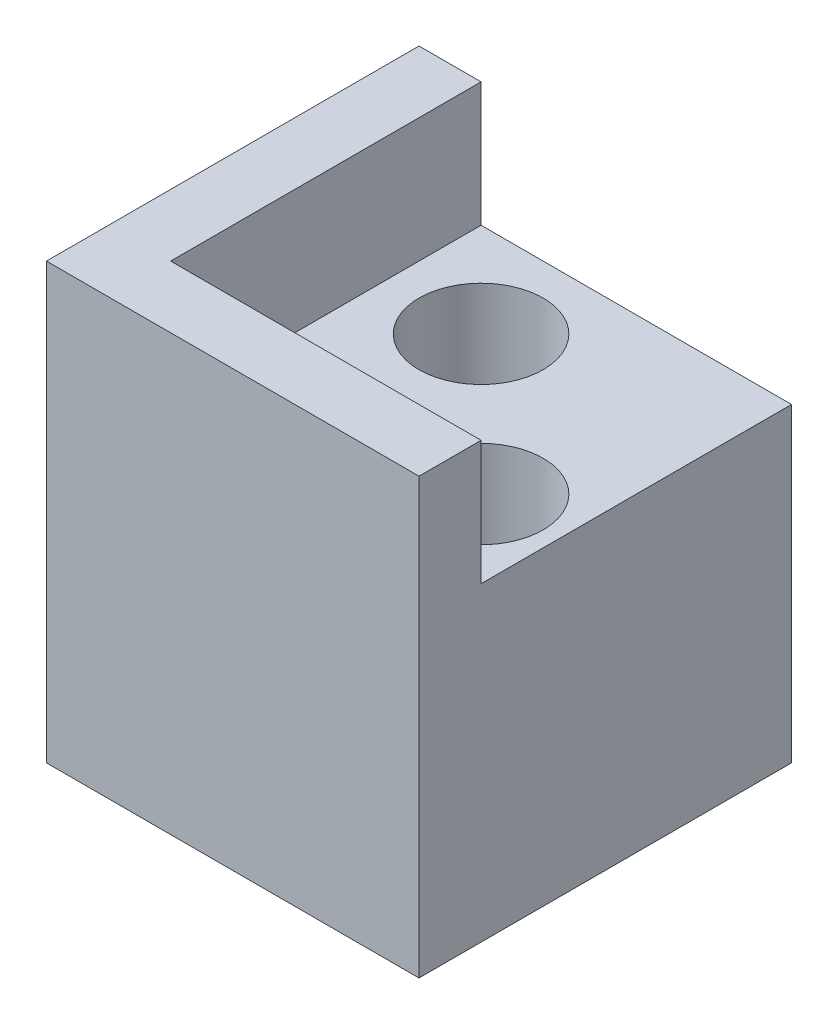
ISO-10303-21;
HEADER;
FILE_DESCRIPTION(('STEP AP214'),'2;1');
FILE_NAME('part.step','',(''),(''),'','','');
FILE_SCHEMA(('AUTOMOTIVE_DESIGN { 1 0 10303 214 1 1 1 1 }'));
ENDSEC;
DATA;
#1=APPLICATION_CONTEXT('core data for automotive mechanical design processes');
#2=APPLICATION_PROTOCOL_DEFINITION('international standard','automotive_design',2000,#1);
#3=PRODUCT_CONTEXT('',#1,'mechanical');
#4=PRODUCT('Part','Part','',(#3));
#5=PRODUCT_RELATED_PRODUCT_CATEGORY('part','',(#4));
#6=PRODUCT_DEFINITION_FORMATION('','',#4);
#7=PRODUCT_DEFINITION_CONTEXT('part definition',#1,'design');
#8=PRODUCT_DEFINITION('design','',#6,#7);
#9=PRODUCT_DEFINITION_SHAPE('','',#8);
#10=(LENGTH_UNIT() NAMED_UNIT(*) SI_UNIT(.MILLI.,.METRE.));
#11=(NAMED_UNIT(*) PLANE_ANGLE_UNIT() SI_UNIT($,.RADIAN.));
#12=(NAMED_UNIT(*) SI_UNIT($,.STERADIAN.) SOLID_ANGLE_UNIT());
#13=UNCERTAINTY_MEASURE_WITH_UNIT(LENGTH_MEASURE(1.E-05),#10,'distance_accuracy_value','');
#14=(GEOMETRIC_REPRESENTATION_CONTEXT(3) GLOBAL_UNCERTAINTY_ASSIGNED_CONTEXT((#13)) GLOBAL_UNIT_ASSIGNED_CONTEXT((#10,
#11,#12)) REPRESENTATION_CONTEXT('',''));
#15=CARTESIAN_POINT('',(0.,0.,0.));
#16=DIRECTION('',(0.,0.,1.));
#17=DIRECTION('',(1.,0.,0.));
#18=AXIS2_PLACEMENT_3D('',#15,#16,#17);
#19=CARTESIAN_POINT('',(15.,35.,-15.));
#20=DIRECTION('',(-1.,0.,0.));
#21=DIRECTION('',(0.,0.,1.));
#22=AXIS2_PLACEMENT_3D('',#19,#20,#21);
#23=PLANE('',#22);
#24=DIRECTION('',(0.,0.,-1.));
#25=VECTOR('',#24,1.);
#26=CARTESIAN_POINT('',(15.,25.,-15.));
#27=LINE('',#26,#25);
#28=CARTESIAN_POINT('',(15.,25.,10.));
#29=VERTEX_POINT('',#28);
#30=CARTESIAN_POINT('',(15.,25.,-15.));
#31=VERTEX_POINT('',#30);
#32=EDGE_CURVE('E101',#29,#31,#27,.T.);
#33=ORIENTED_EDGE('',*,*,#32,.F.);
#34=DIRECTION('',(0.,1.,0.));
#35=VECTOR('',#34,1.);
#36=CARTESIAN_POINT('',(15.,25.,10.));
#37=LINE('',#36,#35);
#38=CARTESIAN_POINT('',(15.,35.,10.));
#39=VERTEX_POINT('',#38);
#40=EDGE_CURVE('E125',#29,#39,#37,.T.);
#41=ORIENTED_EDGE('',*,*,#40,.T.);
#42=DIRECTION('',(0.,0.,-1.));
#43=VECTOR('',#42,1.);
#44=CARTESIAN_POINT('',(15.,35.,-15.));
#45=LINE('',#44,#43);
#46=CARTESIAN_POINT('',(15.,35.,15.));
#47=VERTEX_POINT('',#46);
#48=EDGE_CURVE('E136',#47,#39,#45,.T.);
#49=ORIENTED_EDGE('',*,*,#48,.F.);
#50=DIRECTION('',(0.,-1.,0.));
#51=VECTOR('',#50,1.);
#52=CARTESIAN_POINT('',(15.,35.,15.));
#53=LINE('',#52,#51);
#54=CARTESIAN_POINT('',(15.,0.,15.));
#55=VERTEX_POINT('',#54);
#56=EDGE_CURVE('E122',#47,#55,#53,.T.);
#57=ORIENTED_EDGE('',*,*,#56,.T.);
#58=DIRECTION('',(0.,0.,-1.));
#59=VECTOR('',#58,1.);
#60=CARTESIAN_POINT('',(15.,0.,-15.));
#61=LINE('',#60,#59);
#62=CARTESIAN_POINT('',(15.,0.,-15.));
#63=VERTEX_POINT('',#62);
#64=EDGE_CURVE('E120',#55,#63,#61,.T.);
#65=ORIENTED_EDGE('',*,*,#64,.T.);
#66=DIRECTION('',(0.,-1.,0.));
#67=VECTOR('',#66,1.);
#68=CARTESIAN_POINT('',(15.,35.,-15.));
#69=LINE('',#68,#67);
#70=EDGE_CURVE('E11',#31,#63,#69,.T.);
#71=ORIENTED_EDGE('',*,*,#70,.F.);
#72=EDGE_LOOP('',(#33,#41,#49,#57,#65,#71));
#73=FACE_BOUND('',#72,.T.);
#74=ADVANCED_FACE('F33',(#73),#23,.F.);
#75=CARTESIAN_POINT('',(-15.,35.,-15.));
#76=DIRECTION('',(0.,0.,1.));
#77=DIRECTION('',(1.,0.,0.));
#78=AXIS2_PLACEMENT_3D('',#75,#76,#77);
#79=PLANE('',#78);
#80=DIRECTION('',(-1.,0.,0.));
#81=VECTOR('',#80,1.);
#82=CARTESIAN_POINT('',(-15.,35.,-15.));
#83=LINE('',#82,#81);
#84=CARTESIAN_POINT('',(-10.,35.,-15.));
#85=VERTEX_POINT('',#84);
#86=CARTESIAN_POINT('',(-15.,35.,-15.));
#87=VERTEX_POINT('',#86);
#88=EDGE_CURVE('E79',#85,#87,#83,.T.);
#89=ORIENTED_EDGE('',*,*,#88,.F.);
#90=DIRECTION('',(0.,1.,0.));
#91=VECTOR('',#90,1.);
#92=CARTESIAN_POINT('',(-10.,25.,-15.));
#93=LINE('',#92,#91);
#94=CARTESIAN_POINT('',(-10.,25.,-15.));
#95=VERTEX_POINT('',#94);
#96=EDGE_CURVE('E47',#95,#85,#93,.T.);
#97=ORIENTED_EDGE('',*,*,#96,.F.);
#98=DIRECTION('',(-1.,0.,0.));
#99=VECTOR('',#98,1.);
#100=CARTESIAN_POINT('',(15.,25.,-15.));
#101=LINE('',#100,#99);
#102=EDGE_CURVE('E105',#31,#95,#101,.T.);
#103=ORIENTED_EDGE('',*,*,#102,.F.);
#104=ORIENTED_EDGE('',*,*,#70,.T.);
#105=DIRECTION('',(-1.,0.,0.));
#106=VECTOR('',#105,1.);
#107=CARTESIAN_POINT('',(-15.,0.,-15.));
#108=LINE('',#107,#106);
#109=CARTESIAN_POINT('',(-15.,0.,-15.));
#110=VERTEX_POINT('',#109);
#111=EDGE_CURVE('E124',#63,#110,#108,.T.);
#112=ORIENTED_EDGE('',*,*,#111,.T.);
#113=DIRECTION('',(0.,-1.,0.));
#114=VECTOR('',#113,1.);
#115=CARTESIAN_POINT('',(-15.,35.,-15.));
#116=LINE('',#115,#114);
#117=EDGE_CURVE('E40',#87,#110,#116,.T.);
#118=ORIENTED_EDGE('',*,*,#117,.F.);
#119=EDGE_LOOP('',(#89,#97,#103,#104,#112,#118));
#120=FACE_BOUND('',#119,.T.);
#121=ADVANCED_FACE('F114',(#120),#79,.F.);
#122=CARTESIAN_POINT('',(-15.,35.,-15.));
#123=DIRECTION('',(1.,0.,0.));
#124=DIRECTION('',(0.,0.,-1.));
#125=AXIS2_PLACEMENT_3D('',#122,#123,#124);
#126=PLANE('',#125);
#127=DIRECTION('',(0.,0.,1.));
#128=VECTOR('',#127,1.);
#129=CARTESIAN_POINT('',(-15.,0.,-15.));
#130=LINE('',#129,#128);
#131=CARTESIAN_POINT('',(-15.,0.,15.));
#132=VERTEX_POINT('',#131);
#133=EDGE_CURVE('E127',#110,#132,#130,.T.);
#134=ORIENTED_EDGE('',*,*,#133,.T.);
#135=DIRECTION('',(0.,-1.,0.));
#136=VECTOR('',#135,1.);
#137=CARTESIAN_POINT('',(-15.,35.,15.));
#138=LINE('',#137,#136);
#139=CARTESIAN_POINT('',(-15.,35.,15.));
#140=VERTEX_POINT('',#139);
#141=EDGE_CURVE('E138',#140,#132,#138,.T.);
#142=ORIENTED_EDGE('',*,*,#141,.F.);
#143=DIRECTION('',(0.,0.,1.));
#144=VECTOR('',#143,1.);
#145=CARTESIAN_POINT('',(-15.,35.,-15.));
#146=LINE('',#145,#144);
#147=EDGE_CURVE('E145',#87,#140,#146,.T.);
#148=ORIENTED_EDGE('',*,*,#147,.F.);
#149=ORIENTED_EDGE('',*,*,#117,.T.);
#150=EDGE_LOOP('',(#134,#142,#148,#149));
#151=FACE_BOUND('',#150,.T.);
#152=ADVANCED_FACE('F143',(#151),#126,.F.);
#153=CARTESIAN_POINT('',(-15.,35.,15.));
#154=DIRECTION('',(0.,0.,-1.));
#155=DIRECTION('',(-1.,0.,0.));
#156=AXIS2_PLACEMENT_3D('',#153,#154,#155);
#157=PLANE('',#156);
#158=DIRECTION('',(1.,0.,0.));
#159=VECTOR('',#158,1.);
#160=CARTESIAN_POINT('',(-15.,0.,15.));
#161=LINE('',#160,#159);
#162=EDGE_CURVE('E75',#132,#55,#161,.T.);
#163=ORIENTED_EDGE('',*,*,#162,.T.);
#164=ORIENTED_EDGE('',*,*,#56,.F.);
#165=DIRECTION('',(1.,0.,0.));
#166=VECTOR('',#165,1.);
#167=CARTESIAN_POINT('',(-15.,35.,15.));
#168=LINE('',#167,#166);
#169=EDGE_CURVE('E56',#140,#47,#168,.T.);
#170=ORIENTED_EDGE('',*,*,#169,.F.);
#171=ORIENTED_EDGE('',*,*,#141,.T.);
#172=EDGE_LOOP('',(#163,#164,#170,#171));
#173=FACE_BOUND('',#172,.T.);
#174=ADVANCED_FACE('F159',(#173),#157,.F.);
#175=CARTESIAN_POINT('',(0.,35.,0.));
#176=DIRECTION('',(0.,1.,0.));
#177=DIRECTION('',(0.,0.,1.));
#178=AXIS2_PLACEMENT_3D('',#175,#176,#177);
#179=PLANE('',#178);
#180=DIRECTION('',(1.,0.,0.));
#181=VECTOR('',#180,1.);
#182=CARTESIAN_POINT('',(15.,35.,10.));
#183=LINE('',#182,#181);
#184=CARTESIAN_POINT('',(-10.,35.,10.));
#185=VERTEX_POINT('',#184);
#186=EDGE_CURVE('E111',#185,#39,#183,.T.);
#187=ORIENTED_EDGE('',*,*,#186,.F.);
#188=DIRECTION('',(0.,0.,1.));
#189=VECTOR('',#188,1.);
#190=CARTESIAN_POINT('',(-10.,35.,-15.));
#191=LINE('',#190,#189);
#192=EDGE_CURVE('E293',#85,#185,#191,.T.);
#193=ORIENTED_EDGE('',*,*,#192,.F.);
#194=ORIENTED_EDGE('',*,*,#88,.T.);
#195=ORIENTED_EDGE('',*,*,#147,.T.);
#196=ORIENTED_EDGE('',*,*,#169,.T.);
#197=ORIENTED_EDGE('',*,*,#48,.T.);
#198=EDGE_LOOP('',(#187,#193,#194,#195,#196,#197));
#199=FACE_BOUND('',#198,.T.);
#200=ADVANCED_FACE('F149',(#199),#179,.T.);
#201=CARTESIAN_POINT('',(0.,0.,0.));
#202=DIRECTION('',(0.,1.,0.));
#203=DIRECTION('',(0.,0.,1.));
#204=AXIS2_PLACEMENT_3D('',#201,#202,#203);
#205=PLANE('',#204);
#206=CARTESIAN_POINT('',(-2.42286276232723,0.,-7.42286276232722));
#207=DIRECTION('',(0.,1.,0.));
#208=DIRECTION('',(0.,0.,1.));
#209=AXIS2_PLACEMENT_3D('',#206,#207,#208);
#210=CIRCLE('',#209,2.);
#211=CARTESIAN_POINT('',(-2.42286276232723,0.,-5.42286276232722));
#212=VERTEX_POINT('',#211);
#213=EDGE_CURVE('E281',#212,#212,#210,.T.);
#214=ORIENTED_EDGE('',*,*,#213,.T.);
#215=EDGE_LOOP('',(#214));
#216=FACE_BOUND('',#215,.T.);
#217=CARTESIAN_POINT('',(8.75,0.,3.75));
#218=DIRECTION('',(0.,1.,0.));
#219=DIRECTION('',(0.,0.,1.));
#220=AXIS2_PLACEMENT_3D('',#217,#218,#219);
#221=CIRCLE('',#220,2.);
#222=CARTESIAN_POINT('',(8.75,0.,5.75));
#223=VERTEX_POINT('',#222);
#224=EDGE_CURVE('E280',#223,#223,#221,.T.);
#225=ORIENTED_EDGE('',*,*,#224,.T.);
#226=EDGE_LOOP('',(#225));
#227=FACE_BOUND('',#226,.T.);
#228=ORIENTED_EDGE('',*,*,#64,.F.);
#229=ORIENTED_EDGE('',*,*,#162,.F.);
#230=ORIENTED_EDGE('',*,*,#133,.F.);
#231=ORIENTED_EDGE('',*,*,#111,.F.);
#232=EDGE_LOOP('',(#228,#229,#230,#231));
#233=FACE_BOUND('',#232,.T.);
#234=ADVANCED_FACE('F146',(#216,#227,#233),#205,.F.);
#235=CARTESIAN_POINT('',(15.,25.,10.));
#236=DIRECTION('',(0.,0.,1.));
#237=DIRECTION('',(1.,0.,0.));
#238=AXIS2_PLACEMENT_3D('',#235,#236,#237);
#239=PLANE('',#238);
#240=ORIENTED_EDGE('',*,*,#186,.T.);
#241=ORIENTED_EDGE('',*,*,#40,.F.);
#242=DIRECTION('',(1.,0.,0.));
#243=VECTOR('',#242,1.);
#244=CARTESIAN_POINT('',(15.,25.,10.));
#245=LINE('',#244,#243);
#246=CARTESIAN_POINT('',(-10.,25.,10.));
#247=VERTEX_POINT('',#246);
#248=EDGE_CURVE('E107',#247,#29,#245,.T.);
#249=ORIENTED_EDGE('',*,*,#248,.F.);
#250=DIRECTION('',(0.,1.,0.));
#251=VECTOR('',#250,1.);
#252=CARTESIAN_POINT('',(-10.,25.,10.));
#253=LINE('',#252,#251);
#254=EDGE_CURVE('E129',#247,#185,#253,.T.);
#255=ORIENTED_EDGE('',*,*,#254,.T.);
#256=EDGE_LOOP('',(#240,#241,#249,#255));
#257=FACE_BOUND('',#256,.T.);
#258=ADVANCED_FACE('F148',(#257),#239,.F.);
#259=CARTESIAN_POINT('',(-10.,25.,-15.));
#260=DIRECTION('',(-1.,0.,0.));
#261=DIRECTION('',(0.,0.,1.));
#262=AXIS2_PLACEMENT_3D('',#259,#260,#261);
#263=PLANE('',#262);
#264=ORIENTED_EDGE('',*,*,#192,.T.);
#265=ORIENTED_EDGE('',*,*,#254,.F.);
#266=DIRECTION('',(0.,0.,1.));
#267=VECTOR('',#266,1.);
#268=CARTESIAN_POINT('',(-10.,25.,-15.));
#269=LINE('',#268,#267);
#270=EDGE_CURVE('E116',#95,#247,#269,.T.);
#271=ORIENTED_EDGE('',*,*,#270,.F.);
#272=ORIENTED_EDGE('',*,*,#96,.T.);
#273=EDGE_LOOP('',(#264,#265,#271,#272));
#274=FACE_BOUND('',#273,.T.);
#275=ADVANCED_FACE('F156',(#274),#263,.F.);
#276=CARTESIAN_POINT('',(0.,25.,0.));
#277=DIRECTION('',(0.,-1.,0.));
#278=DIRECTION('',(0.,0.,-1.));
#279=AXIS2_PLACEMENT_3D('',#276,#277,#278);
#280=PLANE('',#279);
#281=CARTESIAN_POINT('',(-2.42286276232723,25.,-7.42286276232722));
#282=DIRECTION('',(0.,1.,0.));
#283=DIRECTION('',(0.,0.,1.));
#284=AXIS2_PLACEMENT_3D('',#281,#282,#283);
#285=CIRCLE('',#284,5.);
#286=CARTESIAN_POINT('',(-2.42286276232723,25.,-2.42286276232722));
#287=VERTEX_POINT('',#286);
#288=EDGE_CURVE('E294',#287,#287,#285,.T.);
#289=ORIENTED_EDGE('',*,*,#288,.F.);
#290=EDGE_LOOP('',(#289));
#291=FACE_BOUND('',#290,.T.);
#292=CARTESIAN_POINT('',(8.75,25.,3.75));
#293=DIRECTION('',(0.,1.,0.));
#294=DIRECTION('',(0.,0.,1.));
#295=AXIS2_PLACEMENT_3D('',#292,#293,#294);
#296=CIRCLE('',#295,5.);
#297=CARTESIAN_POINT('',(8.75,25.,8.75));
#298=VERTEX_POINT('',#297);
#299=EDGE_CURVE('E289',#298,#298,#296,.T.);
#300=ORIENTED_EDGE('',*,*,#299,.F.);
#301=EDGE_LOOP('',(#300));
#302=FACE_BOUND('',#301,.T.);
#303=ORIENTED_EDGE('',*,*,#32,.T.);
#304=ORIENTED_EDGE('',*,*,#102,.T.);
#305=ORIENTED_EDGE('',*,*,#270,.T.);
#306=ORIENTED_EDGE('',*,*,#248,.T.);
#307=EDGE_LOOP('',(#303,#304,#305,#306));
#308=FACE_BOUND('',#307,.T.);
#309=ADVANCED_FACE('F103',(#291,#302,#308),#280,.F.);
#310=CARTESIAN_POINT('',(8.75,5.,3.75));
#311=DIRECTION('',(0.,1.,0.));
#312=DIRECTION('',(0.,0.,1.));
#313=AXIS2_PLACEMENT_3D('',#310,#311,#312);
#314=CYLINDRICAL_SURFACE('',#313,5.);
#315=CARTESIAN_POINT('',(8.75,5.,3.75));
#316=DIRECTION('',(0.,1.,0.));
#317=DIRECTION('',(0.,0.,1.));
#318=AXIS2_PLACEMENT_3D('',#315,#316,#317);
#319=CIRCLE('',#318,5.);
#320=CARTESIAN_POINT('',(8.75,5.,8.75));
#321=VERTEX_POINT('',#320);
#322=EDGE_CURVE('E297',#321,#321,#319,.T.);
#323=ORIENTED_EDGE('',*,*,#322,.F.);
#324=EDGE_LOOP('',(#323));
#325=FACE_BOUND('',#324,.T.);
#326=ORIENTED_EDGE('',*,*,#299,.T.);
#327=EDGE_LOOP('',(#326));
#328=FACE_BOUND('',#327,.T.);
#329=ADVANCED_FACE('F207',(#325,#328),#314,.F.);
#330=CARTESIAN_POINT('',(8.75,5.,3.75));
#331=DIRECTION('',(0.,1.,0.));
#332=DIRECTION('',(0.,0.,1.));
#333=AXIS2_PLACEMENT_3D('',#330,#331,#332);
#334=PLANE('',#333);
#335=CARTESIAN_POINT('',(8.75,5.,3.75));
#336=DIRECTION('',(0.,1.,0.));
#337=DIRECTION('',(0.,0.,1.));
#338=AXIS2_PLACEMENT_3D('',#335,#336,#337);
#339=CIRCLE('',#338,2.);
#340=CARTESIAN_POINT('',(8.75,5.,5.75));
#341=VERTEX_POINT('',#340);
#342=EDGE_CURVE('E277',#341,#341,#339,.T.);
#343=ORIENTED_EDGE('',*,*,#342,.F.);
#344=EDGE_LOOP('',(#343));
#345=FACE_BOUND('',#344,.T.);
#346=ORIENTED_EDGE('',*,*,#322,.T.);
#347=EDGE_LOOP('',(#346));
#348=FACE_BOUND('',#347,.T.);
#349=ADVANCED_FACE('F217',(#345,#348),#334,.T.);
#350=CARTESIAN_POINT('',(-2.42286276232723,5.,-7.42286276232722));
#351=DIRECTION('',(0.,1.,0.));
#352=DIRECTION('',(0.,0.,1.));
#353=AXIS2_PLACEMENT_3D('',#350,#351,#352);
#354=CYLINDRICAL_SURFACE('',#353,5.);
#355=CARTESIAN_POINT('',(-2.42286276232723,5.,-7.42286276232722));
#356=DIRECTION('',(0.,1.,0.));
#357=DIRECTION('',(0.,0.,1.));
#358=AXIS2_PLACEMENT_3D('',#355,#356,#357);
#359=CIRCLE('',#358,5.);
#360=CARTESIAN_POINT('',(-2.42286276232723,5.,-2.42286276232722));
#361=VERTEX_POINT('',#360);
#362=EDGE_CURVE('E290',#361,#361,#359,.T.);
#363=ORIENTED_EDGE('',*,*,#362,.F.);
#364=EDGE_LOOP('',(#363));
#365=FACE_BOUND('',#364,.T.);
#366=ORIENTED_EDGE('',*,*,#288,.T.);
#367=EDGE_LOOP('',(#366));
#368=FACE_BOUND('',#367,.T.);
#369=ADVANCED_FACE('F227',(#365,#368),#354,.F.);
#370=CARTESIAN_POINT('',(-2.42286276232723,5.,-7.42286276232722));
#371=DIRECTION('',(0.,1.,0.));
#372=DIRECTION('',(0.,0.,1.));
#373=AXIS2_PLACEMENT_3D('',#370,#371,#372);
#374=PLANE('',#373);
#375=CARTESIAN_POINT('',(-2.42286276232723,5.,-7.42286276232722));
#376=DIRECTION('',(0.,1.,0.));
#377=DIRECTION('',(0.,0.,1.));
#378=AXIS2_PLACEMENT_3D('',#375,#376,#377);
#379=CIRCLE('',#378,2.);
#380=CARTESIAN_POINT('',(-2.42286276232723,5.,-5.42286276232722));
#381=VERTEX_POINT('',#380);
#382=EDGE_CURVE('E283',#381,#381,#379,.T.);
#383=ORIENTED_EDGE('',*,*,#382,.F.);
#384=EDGE_LOOP('',(#383));
#385=FACE_BOUND('',#384,.T.);
#386=ORIENTED_EDGE('',*,*,#362,.T.);
#387=EDGE_LOOP('',(#386));
#388=FACE_BOUND('',#387,.T.);
#389=ADVANCED_FACE('F237',(#385,#388),#374,.T.);
#390=CARTESIAN_POINT('',(-2.42286276232723,0.,-7.42286276232722));
#391=DIRECTION('',(0.,1.,0.));
#392=DIRECTION('',(0.,0.,1.));
#393=AXIS2_PLACEMENT_3D('',#390,#391,#392);
#394=CYLINDRICAL_SURFACE('',#393,2.);
#395=ORIENTED_EDGE('',*,*,#382,.T.);
#396=EDGE_LOOP('',(#395));
#397=FACE_BOUND('',#396,.T.);
#398=ORIENTED_EDGE('',*,*,#213,.F.);
#399=EDGE_LOOP('',(#398));
#400=FACE_BOUND('',#399,.T.);
#401=ADVANCED_FACE('F246',(#397,#400),#394,.F.);
#402=CARTESIAN_POINT('',(8.75,0.,3.75));
#403=DIRECTION('',(0.,1.,0.));
#404=DIRECTION('',(0.,0.,1.));
#405=AXIS2_PLACEMENT_3D('',#402,#403,#404);
#406=CYLINDRICAL_SURFACE('',#405,2.);
#407=ORIENTED_EDGE('',*,*,#342,.T.);
#408=EDGE_LOOP('',(#407));
#409=FACE_BOUND('',#408,.T.);
#410=ORIENTED_EDGE('',*,*,#224,.F.);
#411=EDGE_LOOP('',(#410));
#412=FACE_BOUND('',#411,.T.);
#413=ADVANCED_FACE('F260',(#409,#412),#406,.F.);
#414=CLOSED_SHELL('',(#74,#121,#152,#174,#200,#234,#258,#275,#309,#329,#349,#369,#389,#401,#413));
#415=MANIFOLD_SOLID_BREP('B2',#414);
#416=ADVANCED_BREP_SHAPE_REPRESENTATION('',(#18,#415),#14);
#417=SHAPE_DEFINITION_REPRESENTATION(#9,#416);
ENDSEC;
END-ISO-10303-21;
